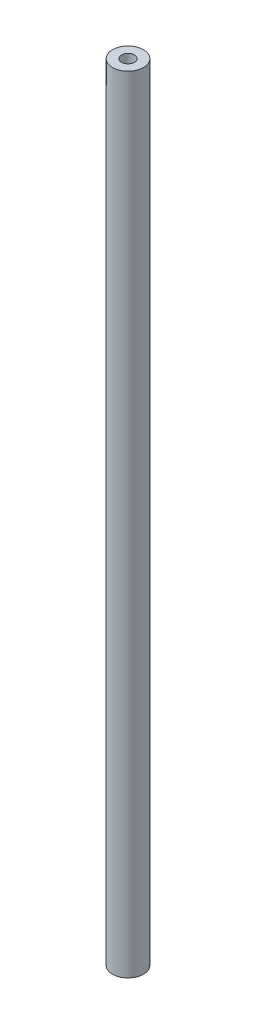
ISO-10303-21;
HEADER;
FILE_DESCRIPTION(('STEP AP214'),'2;1');
FILE_NAME('part.step','',(''),(''),'','','');
FILE_SCHEMA(('AUTOMOTIVE_DESIGN { 1 0 10303 214 1 1 1 1 }'));
ENDSEC;
DATA;
#1=APPLICATION_CONTEXT('core data for automotive mechanical design processes');
#2=APPLICATION_PROTOCOL_DEFINITION('international standard','automotive_design',2000,#1);
#3=PRODUCT_CONTEXT('',#1,'mechanical');
#4=PRODUCT('Part','Part','',(#3));
#5=PRODUCT_RELATED_PRODUCT_CATEGORY('part','',(#4));
#6=PRODUCT_DEFINITION_FORMATION('','',#4);
#7=PRODUCT_DEFINITION_CONTEXT('part definition',#1,'design');
#8=PRODUCT_DEFINITION('design','',#6,#7);
#9=PRODUCT_DEFINITION_SHAPE('','',#8);
#10=(LENGTH_UNIT() NAMED_UNIT(*) SI_UNIT(.MILLI.,.METRE.));
#11=(NAMED_UNIT(*) PLANE_ANGLE_UNIT() SI_UNIT($,.RADIAN.));
#12=(NAMED_UNIT(*) SI_UNIT($,.STERADIAN.) SOLID_ANGLE_UNIT());
#13=UNCERTAINTY_MEASURE_WITH_UNIT(LENGTH_MEASURE(1.E-05),#10,'distance_accuracy_value','');
#14=(GEOMETRIC_REPRESENTATION_CONTEXT(3) GLOBAL_UNCERTAINTY_ASSIGNED_CONTEXT((#13)) GLOBAL_UNIT_ASSIGNED_CONTEXT((#10,
#11,#12)) REPRESENTATION_CONTEXT('',''));
#15=CARTESIAN_POINT('',(0.,0.,0.));
#16=DIRECTION('',(0.,0.,1.));
#17=DIRECTION('',(1.,0.,0.));
#18=AXIS2_PLACEMENT_3D('',#15,#16,#17);
#19=CARTESIAN_POINT('',(0.,152.4,0.));
#20=DIRECTION('',(0.,1.,0.));
#21=DIRECTION('',(0.,0.,1.));
#22=AXIS2_PLACEMENT_3D('',#19,#20,#21);
#23=PLANE('',#22);
#24=CARTESIAN_POINT('',(0.,152.4,0.));
#25=DIRECTION('',(0.,1.,0.));
#26=DIRECTION('',(0.,0.,1.));
#27=AXIS2_PLACEMENT_3D('',#24,#25,#26);
#28=CIRCLE('',#27,6.);
#29=CARTESIAN_POINT('',(0.,152.4,-6.));
#30=VERTEX_POINT('',#29);
#31=EDGE_CURVE('E10',#30,#30,#28,.T.);
#32=ORIENTED_EDGE('',*,*,#31,.T.);
#33=EDGE_LOOP('',(#32));
#34=FACE_BOUND('',#33,.T.);
#35=CARTESIAN_POINT('',(0.,152.4,0.));
#36=DIRECTION('',(0.,1.,0.));
#37=DIRECTION('',(0.,0.,1.));
#38=AXIS2_PLACEMENT_3D('',#35,#36,#37);
#39=CIRCLE('',#38,2.5);
#40=CARTESIAN_POINT('',(0.,152.4,-2.5));
#41=VERTEX_POINT('',#40);
#42=EDGE_CURVE('E42',#41,#41,#39,.T.);
#43=ORIENTED_EDGE('',*,*,#42,.F.);
#44=EDGE_LOOP('',(#43));
#45=FACE_BOUND('',#44,.T.);
#46=ADVANCED_FACE('F31',(#34,#45),#23,.T.);
#47=CARTESIAN_POINT('',(0.,-152.4,0.));
#48=DIRECTION('',(0.,1.,0.));
#49=DIRECTION('',(0.,0.,1.));
#50=AXIS2_PLACEMENT_3D('',#47,#48,#49);
#51=PLANE('',#50);
#52=CARTESIAN_POINT('',(0.,-152.4,0.));
#53=DIRECTION('',(0.,1.,0.));
#54=DIRECTION('',(0.,0.,1.));
#55=AXIS2_PLACEMENT_3D('',#52,#53,#54);
#56=CIRCLE('',#55,6.);
#57=CARTESIAN_POINT('',(0.,-152.4,-6.));
#58=VERTEX_POINT('',#57);
#59=EDGE_CURVE('E35',#58,#58,#56,.T.);
#60=ORIENTED_EDGE('',*,*,#59,.F.);
#61=EDGE_LOOP('',(#60));
#62=FACE_BOUND('',#61,.T.);
#63=CARTESIAN_POINT('',(0.,-152.4,0.));
#64=DIRECTION('',(0.,1.,0.));
#65=DIRECTION('',(0.,0.,1.));
#66=AXIS2_PLACEMENT_3D('',#63,#64,#65);
#67=CIRCLE('',#66,2.5);
#68=CARTESIAN_POINT('',(0.,-152.4,-2.5));
#69=VERTEX_POINT('',#68);
#70=EDGE_CURVE('E44',#69,#69,#67,.T.);
#71=ORIENTED_EDGE('',*,*,#70,.T.);
#72=EDGE_LOOP('',(#71));
#73=FACE_BOUND('',#72,.T.);
#74=ADVANCED_FACE('F54',(#62,#73),#51,.F.);
#75=CARTESIAN_POINT('',(0.,152.4,0.));
#76=DIRECTION('',(0.,-1.,0.));
#77=DIRECTION('',(0.,0.,-1.));
#78=AXIS2_PLACEMENT_3D('',#75,#76,#77);
#79=CYLINDRICAL_SURFACE('',#78,6.);
#80=CARTESIAN_POINT('',(0.,152.4,-6.));
#81=CARTESIAN_POINT('',(0.,149.225,-6.));
#82=CARTESIAN_POINT('',(0.,146.05,-6.));
#83=CARTESIAN_POINT('',(0.,139.7,-6.));
#84=CARTESIAN_POINT('',(0.,136.525,-6.));
#85=CARTESIAN_POINT('',(0.,130.175,-6.));
#86=CARTESIAN_POINT('',(0.,127.,-6.));
#87=CARTESIAN_POINT('',(0.,120.65,-6.));
#88=CARTESIAN_POINT('',(0.,117.475,-6.));
#89=CARTESIAN_POINT('',(0.,111.125,-6.));
#90=CARTESIAN_POINT('',(0.,107.95,-6.));
#91=CARTESIAN_POINT('',(0.,101.6,-6.));
#92=CARTESIAN_POINT('',(0.,98.425,-6.));
#93=CARTESIAN_POINT('',(0.,92.075,-6.));
#94=CARTESIAN_POINT('',(0.,88.9,-6.));
#95=CARTESIAN_POINT('',(0.,82.55,-6.));
#96=CARTESIAN_POINT('',(0.,79.375,-6.));
#97=CARTESIAN_POINT('',(0.,73.025,-6.));
#98=CARTESIAN_POINT('',(0.,69.85,-6.));
#99=CARTESIAN_POINT('',(0.,63.5,-6.));
#100=CARTESIAN_POINT('',(0.,60.325,-6.));
#101=CARTESIAN_POINT('',(0.,53.975,-6.));
#102=CARTESIAN_POINT('',(0.,50.8,-6.));
#103=CARTESIAN_POINT('',(0.,44.45,-6.));
#104=CARTESIAN_POINT('',(0.,41.275,-6.));
#105=CARTESIAN_POINT('',(0.,34.925,-6.));
#106=CARTESIAN_POINT('',(0.,31.75,-6.));
#107=CARTESIAN_POINT('',(0.,25.4,-6.));
#108=CARTESIAN_POINT('',(0.,22.225,-6.));
#109=CARTESIAN_POINT('',(0.,15.875,-6.));
#110=CARTESIAN_POINT('',(0.,12.7,-6.));
#111=CARTESIAN_POINT('',(0.,6.35,-6.));
#112=CARTESIAN_POINT('',(0.,3.175,-6.));
#113=CARTESIAN_POINT('',(0.,-3.175,-6.));
#114=CARTESIAN_POINT('',(0.,-6.35,-6.));
#115=CARTESIAN_POINT('',(0.,-12.7,-6.));
#116=CARTESIAN_POINT('',(0.,-15.875,-6.));
#117=CARTESIAN_POINT('',(0.,-22.225,-6.));
#118=CARTESIAN_POINT('',(0.,-25.4,-6.));
#119=CARTESIAN_POINT('',(0.,-31.75,-6.));
#120=CARTESIAN_POINT('',(0.,-34.925,-6.));
#121=CARTESIAN_POINT('',(0.,-41.275,-6.));
#122=CARTESIAN_POINT('',(0.,-44.45,-6.));
#123=CARTESIAN_POINT('',(0.,-50.8,-6.));
#124=CARTESIAN_POINT('',(0.,-53.975,-6.));
#125=CARTESIAN_POINT('',(0.,-60.325,-6.));
#126=CARTESIAN_POINT('',(0.,-63.5,-6.));
#127=CARTESIAN_POINT('',(0.,-69.85,-6.));
#128=CARTESIAN_POINT('',(0.,-73.025,-6.));
#129=CARTESIAN_POINT('',(0.,-79.375,-6.));
#130=CARTESIAN_POINT('',(0.,-82.55,-6.));
#131=CARTESIAN_POINT('',(0.,-88.9,-6.));
#132=CARTESIAN_POINT('',(0.,-92.075,-6.));
#133=CARTESIAN_POINT('',(0.,-98.425,-6.));
#134=CARTESIAN_POINT('',(0.,-101.6,-6.));
#135=CARTESIAN_POINT('',(0.,-107.95,-6.));
#136=CARTESIAN_POINT('',(0.,-111.125,-6.));
#137=CARTESIAN_POINT('',(0.,-117.475,-6.));
#138=CARTESIAN_POINT('',(0.,-120.65,-6.));
#139=CARTESIAN_POINT('',(0.,-127.,-6.));
#140=CARTESIAN_POINT('',(0.,-130.175,-6.));
#141=CARTESIAN_POINT('',(0.,-136.525,-6.));
#142=CARTESIAN_POINT('',(0.,-139.7,-6.));
#143=CARTESIAN_POINT('',(0.,-146.05,-6.));
#144=CARTESIAN_POINT('',(0.,-149.225,-6.));
#145=CARTESIAN_POINT('',(0.,-152.4,-6.));
#146=B_SPLINE_CURVE_WITH_KNOTS('',3,(#80,#81,#82,#83,#84,#85,#86,#87,#88,#89,#90,#91,#92,#93,
#94,#95,#96,#97,#98,#99,#100,#101,#102,#103,#104,#105,#106,#107,#108,#109,#110,#111,#112,#113,
#114,#115,#116,#117,#118,#119,#120,#121,#122,#123,#124,#125,#126,#127,#128,#129,#130,#131,#132,
#133,#134,#135,#136,#137,#138,#139,#140,#141,#142,#143,#144,#145),.UNSPECIFIED.,.F.,.F.,(4,2,2,
2,2,2,2,2,2,2,2,2,2,2,2,2,2,2,2,2,2,2,2,2,2,2,2,2,2,2,2,2,4),(0.,9.52500000000001,19.05,28.575,
38.1,47.625,57.15,66.675,76.2,85.725,95.25,104.775,114.3,123.825,133.35,142.875,152.4,161.925,
171.45,180.975,190.5,200.025,209.55,219.075,228.6,238.125,247.65,257.175,266.7,276.225,285.75,
295.275,304.8),.UNSPECIFIED.);
#147=EDGE_CURVE('BSEAM33',#30,#58,#146,.T.);
#148=ORIENTED_EDGE('',*,*,#31,.F.);
#149=ORIENTED_EDGE('',*,*,#59,.T.);
#150=ORIENTED_EDGE('',*,*,#147,.T.);
#151=ORIENTED_EDGE('',*,*,#147,.F.);
#152=EDGE_LOOP('',(#148,#150,#149,#151));
#153=FACE_BOUND('',#152,.T.);
#154=ADVANCED_FACE('F33',(#153),#79,.T.);
#155=CARTESIAN_POINT('',(0.,152.4,0.));
#156=DIRECTION('',(0.,-1.,0.));
#157=DIRECTION('',(0.,0.,-1.));
#158=AXIS2_PLACEMENT_3D('',#155,#156,#157);
#159=CYLINDRICAL_SURFACE('',#158,2.5);
#160=CARTESIAN_POINT('',(0.,152.4,-2.5));
#161=CARTESIAN_POINT('',(0.,149.225,-2.5));
#162=CARTESIAN_POINT('',(0.,146.05,-2.5));
#163=CARTESIAN_POINT('',(0.,139.7,-2.5));
#164=CARTESIAN_POINT('',(0.,136.525,-2.5));
#165=CARTESIAN_POINT('',(0.,130.175,-2.5));
#166=CARTESIAN_POINT('',(0.,127.,-2.5));
#167=CARTESIAN_POINT('',(0.,120.65,-2.5));
#168=CARTESIAN_POINT('',(0.,117.475,-2.5));
#169=CARTESIAN_POINT('',(0.,111.125,-2.5));
#170=CARTESIAN_POINT('',(0.,107.95,-2.5));
#171=CARTESIAN_POINT('',(0.,101.6,-2.5));
#172=CARTESIAN_POINT('',(0.,98.425,-2.5));
#173=CARTESIAN_POINT('',(0.,92.075,-2.5));
#174=CARTESIAN_POINT('',(0.,88.9,-2.5));
#175=CARTESIAN_POINT('',(0.,82.55,-2.5));
#176=CARTESIAN_POINT('',(0.,79.375,-2.5));
#177=CARTESIAN_POINT('',(0.,73.025,-2.5));
#178=CARTESIAN_POINT('',(0.,69.85,-2.5));
#179=CARTESIAN_POINT('',(0.,63.5,-2.5));
#180=CARTESIAN_POINT('',(0.,60.325,-2.5));
#181=CARTESIAN_POINT('',(0.,53.975,-2.5));
#182=CARTESIAN_POINT('',(0.,50.8,-2.5));
#183=CARTESIAN_POINT('',(0.,44.45,-2.5));
#184=CARTESIAN_POINT('',(0.,41.275,-2.5));
#185=CARTESIAN_POINT('',(0.,34.925,-2.5));
#186=CARTESIAN_POINT('',(0.,31.75,-2.5));
#187=CARTESIAN_POINT('',(0.,25.4,-2.5));
#188=CARTESIAN_POINT('',(0.,22.225,-2.5));
#189=CARTESIAN_POINT('',(0.,15.875,-2.5));
#190=CARTESIAN_POINT('',(0.,12.7,-2.5));
#191=CARTESIAN_POINT('',(0.,6.34999999999998,-2.5));
#192=CARTESIAN_POINT('',(0.,3.17499999999997,-2.5));
#193=CARTESIAN_POINT('',(0.,-3.17500000000003,-2.5));
#194=CARTESIAN_POINT('',(0.,-6.35000000000003,-2.5));
#195=CARTESIAN_POINT('',(0.,-12.7,-2.5));
#196=CARTESIAN_POINT('',(0.,-15.875,-2.5));
#197=CARTESIAN_POINT('',(0.,-22.225,-2.5));
#198=CARTESIAN_POINT('',(0.,-25.4,-2.5));
#199=CARTESIAN_POINT('',(0.,-31.75,-2.5));
#200=CARTESIAN_POINT('',(0.,-34.925,-2.5));
#201=CARTESIAN_POINT('',(0.,-41.275,-2.5));
#202=CARTESIAN_POINT('',(0.,-44.45,-2.5));
#203=CARTESIAN_POINT('',(0.,-50.8,-2.5));
#204=CARTESIAN_POINT('',(0.,-53.975,-2.5));
#205=CARTESIAN_POINT('',(0.,-60.325,-2.5));
#206=CARTESIAN_POINT('',(0.,-63.5,-2.5));
#207=CARTESIAN_POINT('',(0.,-69.85,-2.5));
#208=CARTESIAN_POINT('',(0.,-73.025,-2.5));
#209=CARTESIAN_POINT('',(0.,-79.375,-2.5));
#210=CARTESIAN_POINT('',(0.,-82.5500000000001,-2.5));
#211=CARTESIAN_POINT('',(0.,-88.9,-2.5));
#212=CARTESIAN_POINT('',(0.,-92.0750000000001,-2.5));
#213=CARTESIAN_POINT('',(0.,-98.425,-2.5));
#214=CARTESIAN_POINT('',(0.,-101.6,-2.5));
#215=CARTESIAN_POINT('',(0.,-107.95,-2.5));
#216=CARTESIAN_POINT('',(0.,-111.125,-2.5));
#217=CARTESIAN_POINT('',(0.,-117.475,-2.5));
#218=CARTESIAN_POINT('',(0.,-120.65,-2.5));
#219=CARTESIAN_POINT('',(0.,-127.,-2.5));
#220=CARTESIAN_POINT('',(0.,-130.175,-2.5));
#221=CARTESIAN_POINT('',(0.,-136.525,-2.5));
#222=CARTESIAN_POINT('',(0.,-139.7,-2.5));
#223=CARTESIAN_POINT('',(0.,-146.05,-2.5));
#224=CARTESIAN_POINT('',(0.,-149.225,-2.5));
#225=CARTESIAN_POINT('',(0.,-152.4,-2.5));
#226=B_SPLINE_CURVE_WITH_KNOTS('',3,(#160,#161,#162,#163,#164,#165,#166,#167,#168,#169,#170,
#171,#172,#173,#174,#175,#176,#177,#178,#179,#180,#181,#182,#183,#184,#185,#186,#187,#188,#189,
#190,#191,#192,#193,#194,#195,#196,#197,#198,#199,#200,#201,#202,#203,#204,#205,#206,#207,#208,
#209,#210,#211,#212,#213,#214,#215,#216,#217,#218,#219,#220,#221,#222,#223,#224,#225),
.UNSPECIFIED.,.F.,.F.,(4,2,2,2,2,2,2,2,2,2,2,2,2,2,2,2,2,2,2,2,2,2,2,2,2,2,2,2,2,2,2,2,4),(0.,
9.52499999999998,19.05,28.575,38.1,47.625,57.15,66.675,76.2,85.725,95.25,104.775,114.3,123.825,
133.35,142.875,152.4,161.925,171.45,180.975,190.5,200.025,209.55,219.075,228.6,238.125,247.65,
257.175,266.7,276.225,285.75,295.275,304.8),.UNSPECIFIED.);
#227=EDGE_CURVE('BSEAM50',#41,#69,#226,.T.);
#228=ORIENTED_EDGE('',*,*,#42,.T.);
#229=ORIENTED_EDGE('',*,*,#70,.F.);
#230=ORIENTED_EDGE('',*,*,#227,.T.);
#231=ORIENTED_EDGE('',*,*,#227,.F.);
#232=EDGE_LOOP('',(#228,#230,#229,#231));
#233=FACE_BOUND('',#232,.T.);
#234=ADVANCED_FACE('F50',(#233),#159,.F.);
#235=CLOSED_SHELL('',(#46,#74,#154,#234));
#236=MANIFOLD_SOLID_BREP('B2',#235);
#237=ADVANCED_BREP_SHAPE_REPRESENTATION('',(#18,#236),#14);
#238=SHAPE_DEFINITION_REPRESENTATION(#9,#237);
ENDSEC;
END-ISO-10303-21;
